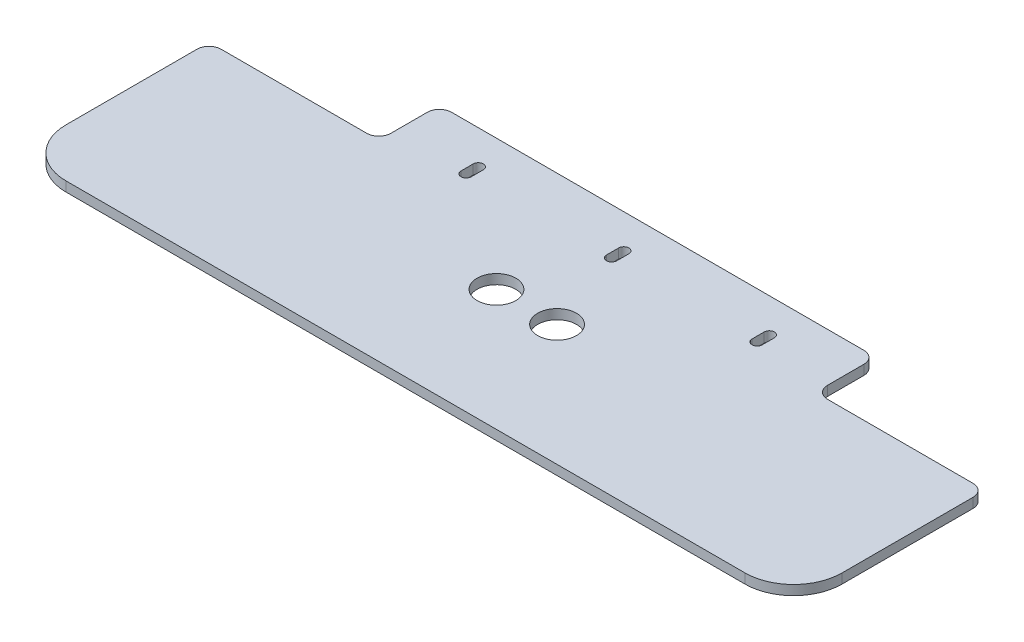
ISO-10303-21;
HEADER;
FILE_DESCRIPTION(('STEP AP214'),'2;1');
FILE_NAME('part.step','',(''),(''),'','','');
FILE_SCHEMA(('AUTOMOTIVE_DESIGN { 1 0 10303 214 1 1 1 1 }'));
ENDSEC;
DATA;
#1=APPLICATION_CONTEXT('core data for automotive mechanical design processes');
#2=APPLICATION_PROTOCOL_DEFINITION('international standard','automotive_design',2000,#1);
#3=PRODUCT_CONTEXT('',#1,'mechanical');
#4=PRODUCT('Part','Part','',(#3));
#5=PRODUCT_RELATED_PRODUCT_CATEGORY('part','',(#4));
#6=PRODUCT_DEFINITION_FORMATION('','',#4);
#7=PRODUCT_DEFINITION_CONTEXT('part definition',#1,'design');
#8=PRODUCT_DEFINITION('design','',#6,#7);
#9=PRODUCT_DEFINITION_SHAPE('','',#8);
#10=(LENGTH_UNIT() NAMED_UNIT(*) SI_UNIT(.MILLI.,.METRE.));
#11=(NAMED_UNIT(*) PLANE_ANGLE_UNIT() SI_UNIT($,.RADIAN.));
#12=(NAMED_UNIT(*) SI_UNIT($,.STERADIAN.) SOLID_ANGLE_UNIT());
#13=UNCERTAINTY_MEASURE_WITH_UNIT(LENGTH_MEASURE(1.E-05),#10,'distance_accuracy_value','');
#14=(GEOMETRIC_REPRESENTATION_CONTEXT(3) GLOBAL_UNCERTAINTY_ASSIGNED_CONTEXT((#13)) GLOBAL_UNIT_ASSIGNED_CONTEXT((#10,
#11,#12)) REPRESENTATION_CONTEXT('',''));
#15=CARTESIAN_POINT('',(0.,0.,0.));
#16=DIRECTION('',(0.,0.,1.));
#17=DIRECTION('',(1.,0.,0.));
#18=AXIS2_PLACEMENT_3D('',#15,#16,#17);
#19=CARTESIAN_POINT('',(-160.,4.,50.));
#20=DIRECTION('',(1.,0.,0.));
#21=DIRECTION('',(0.,0.,-1.));
#22=AXIS2_PLACEMENT_3D('',#19,#20,#21);
#23=PLANE('',#22);
#24=DIRECTION('',(0.,0.,1.));
#25=VECTOR('',#24,1.);
#26=CARTESIAN_POINT('',(-160.,4.,50.));
#27=LINE('',#26,#25);
#28=CARTESIAN_POINT('',(-160.,4.,-24.));
#29=VERTEX_POINT('',#28);
#30=CARTESIAN_POINT('',(-160.,4.,30.));
#31=VERTEX_POINT('',#30);
#32=EDGE_CURVE('E332',#29,#31,#27,.T.);
#33=ORIENTED_EDGE('',*,*,#32,.F.);
#34=DIRECTION('',(0.,-1.,0.));
#35=VECTOR('',#34,1.);
#36=CARTESIAN_POINT('',(-160.,4.,-24.));
#37=LINE('',#36,#35);
#38=CARTESIAN_POINT('',(-160.,0.,-24.));
#39=VERTEX_POINT('',#38);
#40=EDGE_CURVE('E473',#29,#39,#37,.T.);
#41=ORIENTED_EDGE('',*,*,#40,.T.);
#42=DIRECTION('',(0.,0.,1.));
#43=VECTOR('',#42,1.);
#44=CARTESIAN_POINT('',(-160.,0.,50.));
#45=LINE('',#44,#43);
#46=CARTESIAN_POINT('',(-160.,0.,30.));
#47=VERTEX_POINT('',#46);
#48=EDGE_CURVE('E331',#39,#47,#45,.T.);
#49=ORIENTED_EDGE('',*,*,#48,.T.);
#50=DIRECTION('',(0.,-1.,0.));
#51=VECTOR('',#50,1.);
#52=CARTESIAN_POINT('',(-160.,4.,30.));
#53=LINE('',#52,#51);
#54=EDGE_CURVE('E469',#47,#31,#53,.F.);
#55=ORIENTED_EDGE('',*,*,#54,.T.);
#56=EDGE_LOOP('',(#33,#41,#49,#55));
#57=FACE_BOUND('',#56,.T.);
#58=ADVANCED_FACE('F43',(#57),#23,.F.);
#59=CARTESIAN_POINT('',(-160.,4.,50.));
#60=DIRECTION('',(0.,0.,-1.));
#61=DIRECTION('',(-1.,0.,0.));
#62=AXIS2_PLACEMENT_3D('',#59,#60,#61);
#63=PLANE('',#62);
#64=DIRECTION('',(1.,0.,0.));
#65=VECTOR('',#64,1.);
#66=CARTESIAN_POINT('',(-160.,0.,50.));
#67=LINE('',#66,#65);
#68=CARTESIAN_POINT('',(-140.,0.,50.));
#69=VERTEX_POINT('',#68);
#70=CARTESIAN_POINT('',(140.,0.,50.));
#71=VERTEX_POINT('',#70);
#72=EDGE_CURVE('E366',#69,#71,#67,.T.);
#73=ORIENTED_EDGE('',*,*,#72,.T.);
#74=DIRECTION('',(0.,-1.,0.));
#75=VECTOR('',#74,1.);
#76=CARTESIAN_POINT('',(140.,4.,50.));
#77=LINE('',#76,#75);
#78=CARTESIAN_POINT('',(140.,4.,50.));
#79=VERTEX_POINT('',#78);
#80=EDGE_CURVE('E460',#71,#79,#77,.F.);
#81=ORIENTED_EDGE('',*,*,#80,.T.);
#82=DIRECTION('',(1.,0.,0.));
#83=VECTOR('',#82,1.);
#84=CARTESIAN_POINT('',(-160.,4.,50.));
#85=LINE('',#84,#83);
#86=CARTESIAN_POINT('',(-140.,4.,50.));
#87=VERTEX_POINT('',#86);
#88=EDGE_CURVE('E335',#87,#79,#85,.T.);
#89=ORIENTED_EDGE('',*,*,#88,.F.);
#90=DIRECTION('',(0.,-1.,0.));
#91=VECTOR('',#90,1.);
#92=CARTESIAN_POINT('',(-140.,4.,50.));
#93=LINE('',#92,#91);
#94=EDGE_CURVE('E456',#87,#69,#93,.T.);
#95=ORIENTED_EDGE('',*,*,#94,.T.);
#96=EDGE_LOOP('',(#73,#81,#89,#95));
#97=FACE_BOUND('',#96,.T.);
#98=ADVANCED_FACE('F568',(#97),#63,.F.);
#99=CARTESIAN_POINT('',(160.,4.,50.));
#100=DIRECTION('',(-1.,0.,0.));
#101=DIRECTION('',(0.,0.,1.));
#102=AXIS2_PLACEMENT_3D('',#99,#100,#101);
#103=PLANE('',#102);
#104=DIRECTION('',(0.,0.,-1.));
#105=VECTOR('',#104,1.);
#106=CARTESIAN_POINT('',(160.,0.,50.));
#107=LINE('',#106,#105);
#108=CARTESIAN_POINT('',(160.,0.,30.));
#109=VERTEX_POINT('',#108);
#110=CARTESIAN_POINT('',(160.,0.,-24.));
#111=VERTEX_POINT('',#110);
#112=EDGE_CURVE('E370',#109,#111,#107,.T.);
#113=ORIENTED_EDGE('',*,*,#112,.T.);
#114=DIRECTION('',(0.,-1.,0.));
#115=VECTOR('',#114,1.);
#116=CARTESIAN_POINT('',(160.,4.,-24.));
#117=LINE('',#116,#115);
#118=CARTESIAN_POINT('',(160.,4.,-24.));
#119=VERTEX_POINT('',#118);
#120=EDGE_CURVE('E496',#111,#119,#117,.F.);
#121=ORIENTED_EDGE('',*,*,#120,.T.);
#122=DIRECTION('',(0.,0.,-1.));
#123=VECTOR('',#122,1.);
#124=CARTESIAN_POINT('',(160.,4.,50.));
#125=LINE('',#124,#123);
#126=CARTESIAN_POINT('',(160.,4.,30.));
#127=VERTEX_POINT('',#126);
#128=EDGE_CURVE('E340',#127,#119,#125,.T.);
#129=ORIENTED_EDGE('',*,*,#128,.F.);
#130=DIRECTION('',(0.,-1.,0.));
#131=VECTOR('',#130,1.);
#132=CARTESIAN_POINT('',(160.,4.,30.));
#133=LINE('',#132,#131);
#134=EDGE_CURVE('E445',#127,#109,#133,.T.);
#135=ORIENTED_EDGE('',*,*,#134,.T.);
#136=EDGE_LOOP('',(#113,#121,#129,#135));
#137=FACE_BOUND('',#136,.T.);
#138=ADVANCED_FACE('F574',(#137),#103,.F.);
#139=CARTESIAN_POINT('',(90.,4.,-29.));
#140=DIRECTION('',(0.,0.,1.));
#141=DIRECTION('',(1.,0.,0.));
#142=AXIS2_PLACEMENT_3D('',#139,#140,#141);
#143=PLANE('',#142);
#144=DIRECTION('',(-1.,0.,0.));
#145=VECTOR('',#144,1.);
#146=CARTESIAN_POINT('',(90.,4.,-29.));
#147=LINE('',#146,#145);
#148=CARTESIAN_POINT('',(155.,4.,-29.));
#149=VERTEX_POINT('',#148);
#150=CARTESIAN_POINT('',(95.,4.,-29.));
#151=VERTEX_POINT('',#150);
#152=EDGE_CURVE('E344',#149,#151,#147,.T.);
#153=ORIENTED_EDGE('',*,*,#152,.F.);
#154=DIRECTION('',(0.,-1.,0.));
#155=VECTOR('',#154,1.);
#156=CARTESIAN_POINT('',(155.,4.,-29.));
#157=LINE('',#156,#155);
#158=CARTESIAN_POINT('',(155.,0.,-29.));
#159=VERTEX_POINT('',#158);
#160=EDGE_CURVE('E492',#149,#159,#157,.T.);
#161=ORIENTED_EDGE('',*,*,#160,.T.);
#162=DIRECTION('',(-1.,0.,0.));
#163=VECTOR('',#162,1.);
#164=CARTESIAN_POINT('',(90.,0.,-29.));
#165=LINE('',#164,#163);
#166=CARTESIAN_POINT('',(95.,0.,-29.));
#167=VERTEX_POINT('',#166);
#168=EDGE_CURVE('E374',#159,#167,#165,.T.);
#169=ORIENTED_EDGE('',*,*,#168,.T.);
#170=DIRECTION('',(0.,-1.,0.));
#171=VECTOR('',#170,1.);
#172=CARTESIAN_POINT('',(95.,4.,-29.));
#173=LINE('',#172,#171);
#174=EDGE_CURVE('E428',#167,#151,#173,.F.);
#175=ORIENTED_EDGE('',*,*,#174,.T.);
#176=EDGE_LOOP('',(#153,#161,#169,#175));
#177=FACE_BOUND('',#176,.T.);
#178=ADVANCED_FACE('F633',(#177),#143,.F.);
#179=CARTESIAN_POINT('',(90.,4.,-54.));
#180=DIRECTION('',(-1.,0.,0.));
#181=DIRECTION('',(0.,0.,1.));
#182=AXIS2_PLACEMENT_3D('',#179,#180,#181);
#183=PLANE('',#182);
#184=DIRECTION('',(0.,0.,-1.));
#185=VECTOR('',#184,1.);
#186=CARTESIAN_POINT('',(90.,4.,-54.));
#187=LINE('',#186,#185);
#188=CARTESIAN_POINT('',(90.,4.,-34.));
#189=VERTEX_POINT('',#188);
#190=CARTESIAN_POINT('',(90.,4.,-49.));
#191=VERTEX_POINT('',#190);
#192=EDGE_CURVE('E347',#189,#191,#187,.T.);
#193=ORIENTED_EDGE('',*,*,#192,.F.);
#194=DIRECTION('',(0.,-1.,0.));
#195=VECTOR('',#194,1.);
#196=CARTESIAN_POINT('',(90.,0.,-34.));
#197=LINE('',#196,#195);
#198=CARTESIAN_POINT('',(90.,0.,-34.));
#199=VERTEX_POINT('',#198);
#200=EDGE_CURVE('E424',#189,#199,#197,.T.);
#201=ORIENTED_EDGE('',*,*,#200,.T.);
#202=DIRECTION('',(0.,0.,-1.));
#203=VECTOR('',#202,1.);
#204=CARTESIAN_POINT('',(90.,0.,-54.));
#205=LINE('',#204,#203);
#206=CARTESIAN_POINT('',(90.,0.,-49.));
#207=VERTEX_POINT('',#206);
#208=EDGE_CURVE('E377',#199,#207,#205,.T.);
#209=ORIENTED_EDGE('',*,*,#208,.T.);
#210=DIRECTION('',(0.,-1.,0.));
#211=VECTOR('',#210,1.);
#212=CARTESIAN_POINT('',(90.,4.,-49.));
#213=LINE('',#212,#211);
#214=EDGE_CURVE('E421',#207,#191,#213,.F.);
#215=ORIENTED_EDGE('',*,*,#214,.T.);
#216=EDGE_LOOP('',(#193,#201,#209,#215));
#217=FACE_BOUND('',#216,.T.);
#218=ADVANCED_FACE('F641',(#217),#183,.F.);
#219=CARTESIAN_POINT('',(-90.,4.,-54.));
#220=DIRECTION('',(0.,0.,1.));
#221=DIRECTION('',(1.,0.,0.));
#222=AXIS2_PLACEMENT_3D('',#219,#220,#221);
#223=PLANE('',#222);
#224=DIRECTION('',(-1.,0.,0.));
#225=VECTOR('',#224,1.);
#226=CARTESIAN_POINT('',(-90.,0.,-54.));
#227=LINE('',#226,#225);
#228=CARTESIAN_POINT('',(85.,0.,-54.));
#229=VERTEX_POINT('',#228);
#230=CARTESIAN_POINT('',(-85.,0.,-54.));
#231=VERTEX_POINT('',#230);
#232=EDGE_CURVE('E381',#229,#231,#227,.T.);
#233=ORIENTED_EDGE('',*,*,#232,.T.);
#234=DIRECTION('',(0.,-1.,0.));
#235=VECTOR('',#234,1.);
#236=CARTESIAN_POINT('',(-85.,4.,-54.));
#237=LINE('',#236,#235);
#238=CARTESIAN_POINT('',(-85.,4.,-54.));
#239=VERTEX_POINT('',#238);
#240=EDGE_CURVE('E412',#231,#239,#237,.F.);
#241=ORIENTED_EDGE('',*,*,#240,.T.);
#242=DIRECTION('',(-1.,0.,0.));
#243=VECTOR('',#242,1.);
#244=CARTESIAN_POINT('',(-90.,4.,-54.));
#245=LINE('',#244,#243);
#246=CARTESIAN_POINT('',(85.,4.,-54.));
#247=VERTEX_POINT('',#246);
#248=EDGE_CURVE('E351',#247,#239,#245,.T.);
#249=ORIENTED_EDGE('',*,*,#248,.F.);
#250=DIRECTION('',(0.,-1.,0.));
#251=VECTOR('',#250,1.);
#252=CARTESIAN_POINT('',(85.,4.,-54.));
#253=LINE('',#252,#251);
#254=EDGE_CURVE('E408',#247,#229,#253,.T.);
#255=ORIENTED_EDGE('',*,*,#254,.T.);
#256=EDGE_LOOP('',(#233,#241,#249,#255));
#257=FACE_BOUND('',#256,.T.);
#258=ADVANCED_FACE('F648',(#257),#223,.F.);
#259=CARTESIAN_POINT('',(-90.,4.,-54.));
#260=DIRECTION('',(1.,0.,0.));
#261=DIRECTION('',(0.,0.,-1.));
#262=AXIS2_PLACEMENT_3D('',#259,#260,#261);
#263=PLANE('',#262);
#264=DIRECTION('',(0.,0.,1.));
#265=VECTOR('',#264,1.);
#266=CARTESIAN_POINT('',(-90.,0.,-54.));
#267=LINE('',#266,#265);
#268=CARTESIAN_POINT('',(-90.,0.,-49.));
#269=VERTEX_POINT('',#268);
#270=CARTESIAN_POINT('',(-90.,0.,-34.));
#271=VERTEX_POINT('',#270);
#272=EDGE_CURVE('E385',#269,#271,#267,.T.);
#273=ORIENTED_EDGE('',*,*,#272,.T.);
#274=DIRECTION('',(0.,-1.,0.));
#275=VECTOR('',#274,1.);
#276=CARTESIAN_POINT('',(-90.,4.,-34.));
#277=LINE('',#276,#275);
#278=CARTESIAN_POINT('',(-90.,4.,-34.));
#279=VERTEX_POINT('',#278);
#280=EDGE_CURVE('E399',#271,#279,#277,.F.);
#281=ORIENTED_EDGE('',*,*,#280,.T.);
#282=DIRECTION('',(0.,0.,1.));
#283=VECTOR('',#282,1.);
#284=CARTESIAN_POINT('',(-90.,4.,-54.));
#285=LINE('',#284,#283);
#286=CARTESIAN_POINT('',(-90.,4.,-49.));
#287=VERTEX_POINT('',#286);
#288=EDGE_CURVE('E355',#287,#279,#285,.T.);
#289=ORIENTED_EDGE('',*,*,#288,.F.);
#290=DIRECTION('',(0.,-1.,0.));
#291=VECTOR('',#290,1.);
#292=CARTESIAN_POINT('',(-90.,4.,-49.));
#293=LINE('',#292,#291);
#294=EDGE_CURVE('E395',#287,#269,#293,.T.);
#295=ORIENTED_EDGE('',*,*,#294,.T.);
#296=EDGE_LOOP('',(#273,#281,#289,#295));
#297=FACE_BOUND('',#296,.T.);
#298=ADVANCED_FACE('F655',(#297),#263,.F.);
#299=CARTESIAN_POINT('',(-90.,4.,-29.));
#300=DIRECTION('',(0.,0.,1.));
#301=DIRECTION('',(1.,0.,0.));
#302=AXIS2_PLACEMENT_3D('',#299,#300,#301);
#303=PLANE('',#302);
#304=DIRECTION('',(-1.,0.,0.));
#305=VECTOR('',#304,1.);
#306=CARTESIAN_POINT('',(-90.,0.,-29.));
#307=LINE('',#306,#305);
#308=CARTESIAN_POINT('',(-95.,0.,-29.));
#309=VERTEX_POINT('',#308);
#310=CARTESIAN_POINT('',(-155.,0.,-29.));
#311=VERTEX_POINT('',#310);
#312=EDGE_CURVE('E336',#309,#311,#307,.T.);
#313=ORIENTED_EDGE('',*,*,#312,.T.);
#314=DIRECTION('',(0.,-1.,0.));
#315=VECTOR('',#314,1.);
#316=CARTESIAN_POINT('',(-155.,4.,-29.));
#317=LINE('',#316,#315);
#318=CARTESIAN_POINT('',(-155.,4.,-29.));
#319=VERTEX_POINT('',#318);
#320=EDGE_CURVE('E483',#311,#319,#317,.F.);
#321=ORIENTED_EDGE('',*,*,#320,.T.);
#322=DIRECTION('',(-1.,0.,0.));
#323=VECTOR('',#322,1.);
#324=CARTESIAN_POINT('',(-90.,4.,-29.));
#325=LINE('',#324,#323);
#326=CARTESIAN_POINT('',(-95.,4.,-29.));
#327=VERTEX_POINT('',#326);
#328=EDGE_CURVE('E359',#327,#319,#325,.T.);
#329=ORIENTED_EDGE('',*,*,#328,.F.);
#330=DIRECTION('',(0.,-1.,0.));
#331=VECTOR('',#330,1.);
#332=CARTESIAN_POINT('',(-95.,0.,-29.));
#333=LINE('',#332,#331);
#334=EDGE_CURVE('E363',#327,#309,#333,.T.);
#335=ORIENTED_EDGE('',*,*,#334,.T.);
#336=EDGE_LOOP('',(#313,#321,#329,#335));
#337=FACE_BOUND('',#336,.T.);
#338=ADVANCED_FACE('F660',(#337),#303,.F.);
#339=CARTESIAN_POINT('',(0.,4.,0.));
#340=DIRECTION('',(0.,1.,0.));
#341=DIRECTION('',(0.,0.,1.));
#342=AXIS2_PLACEMENT_3D('',#339,#340,#341);
#343=PLANE('',#342);
#344=CARTESIAN_POINT('',(-60.,4.,-34.9999999999996));
#345=DIRECTION('',(0.,1.,0.));
#346=DIRECTION('',(0.,0.,1.));
#347=AXIS2_PLACEMENT_3D('',#344,#345,#346);
#348=CIRCLE('',#347,2.1);
#349=CARTESIAN_POINT('',(-62.1,4.,-34.9999999999996));
#350=VERTEX_POINT('',#349);
#351=CARTESIAN_POINT('',(-57.9,4.,-34.9999999999996));
#352=VERTEX_POINT('',#351);
#353=EDGE_CURVE('E59',#350,#352,#348,.T.);
#354=ORIENTED_EDGE('',*,*,#353,.F.);
#355=DIRECTION('',(0.,0.,1.));
#356=VECTOR('',#355,1.);
#357=CARTESIAN_POINT('',(-62.1,4.,-34.9999999999996));
#358=LINE('',#357,#356);
#359=CARTESIAN_POINT('',(-62.1,4.,-39.9999999999996));
#360=VERTEX_POINT('',#359);
#361=EDGE_CURVE('E268',#360,#350,#358,.T.);
#362=ORIENTED_EDGE('',*,*,#361,.F.);
#363=CARTESIAN_POINT('',(-60.,4.,-39.9999999999996));
#364=DIRECTION('',(0.,1.,0.));
#365=DIRECTION('',(0.,0.,1.));
#366=AXIS2_PLACEMENT_3D('',#363,#364,#365);
#367=CIRCLE('',#366,2.1);
#368=CARTESIAN_POINT('',(-57.9,4.,-39.9999999999996));
#369=VERTEX_POINT('',#368);
#370=EDGE_CURVE('E281',#369,#360,#367,.T.);
#371=ORIENTED_EDGE('',*,*,#370,.F.);
#372=DIRECTION('',(0.,0.,-1.));
#373=VECTOR('',#372,1.);
#374=CARTESIAN_POINT('',(-57.9,4.,-34.9999999999996));
#375=LINE('',#374,#373);
#376=EDGE_CURVE('E285',#352,#369,#375,.T.);
#377=ORIENTED_EDGE('',*,*,#376,.F.);
#378=EDGE_LOOP('',(#354,#362,#371,#377));
#379=FACE_BOUND('',#378,.T.);
#380=CARTESIAN_POINT('',(60.,4.,-35.));
#381=DIRECTION('',(0.,1.,0.));
#382=DIRECTION('',(0.,0.,1.));
#383=AXIS2_PLACEMENT_3D('',#380,#381,#382);
#384=CIRCLE('',#383,2.1);
#385=CARTESIAN_POINT('',(57.9,4.,-35.));
#386=VERTEX_POINT('',#385);
#387=CARTESIAN_POINT('',(62.1,4.,-35.));
#388=VERTEX_POINT('',#387);
#389=EDGE_CURVE('E67',#386,#388,#384,.T.);
#390=ORIENTED_EDGE('',*,*,#389,.F.);
#391=DIRECTION('',(0.,0.,1.));
#392=VECTOR('',#391,1.);
#393=CARTESIAN_POINT('',(57.9,4.,-35.));
#394=LINE('',#393,#392);
#395=CARTESIAN_POINT('',(57.9,4.,-40.));
#396=VERTEX_POINT('',#395);
#397=EDGE_CURVE('E240',#396,#386,#394,.T.);
#398=ORIENTED_EDGE('',*,*,#397,.F.);
#399=CARTESIAN_POINT('',(60.,4.,-40.));
#400=DIRECTION('',(0.,1.,0.));
#401=DIRECTION('',(0.,0.,1.));
#402=AXIS2_PLACEMENT_3D('',#399,#400,#401);
#403=CIRCLE('',#402,2.1);
#404=CARTESIAN_POINT('',(62.1,4.,-40.));
#405=VERTEX_POINT('',#404);
#406=EDGE_CURVE('E247',#405,#396,#403,.T.);
#407=ORIENTED_EDGE('',*,*,#406,.F.);
#408=DIRECTION('',(0.,0.,-1.));
#409=VECTOR('',#408,1.);
#410=CARTESIAN_POINT('',(62.1,4.,-35.));
#411=LINE('',#410,#409);
#412=EDGE_CURVE('E254',#388,#405,#411,.T.);
#413=ORIENTED_EDGE('',*,*,#412,.F.);
#414=EDGE_LOOP('',(#390,#398,#407,#413));
#415=FACE_BOUND('',#414,.T.);
#416=CARTESIAN_POINT('',(0.,4.,-35.));
#417=DIRECTION('',(0.,1.,0.));
#418=DIRECTION('',(0.,0.,1.));
#419=AXIS2_PLACEMENT_3D('',#416,#417,#418);
#420=CIRCLE('',#419,2.1);
#421=CARTESIAN_POINT('',(-2.1,4.,-35.));
#422=VERTEX_POINT('',#421);
#423=CARTESIAN_POINT('',(2.1,4.,-35.));
#424=VERTEX_POINT('',#423);
#425=EDGE_CURVE('E256',#422,#424,#420,.T.);
#426=ORIENTED_EDGE('',*,*,#425,.F.);
#427=DIRECTION('',(0.,0.,1.));
#428=VECTOR('',#427,1.);
#429=CARTESIAN_POINT('',(-2.1,4.,-35.));
#430=LINE('',#429,#428);
#431=CARTESIAN_POINT('',(-2.1,4.,-40.));
#432=VERTEX_POINT('',#431);
#433=EDGE_CURVE('E298',#432,#422,#430,.T.);
#434=ORIENTED_EDGE('',*,*,#433,.F.);
#435=CARTESIAN_POINT('',(0.,4.,-40.));
#436=DIRECTION('',(0.,1.,0.));
#437=DIRECTION('',(0.,0.,1.));
#438=AXIS2_PLACEMENT_3D('',#435,#436,#437);
#439=CIRCLE('',#438,2.1);
#440=CARTESIAN_POINT('',(2.1,4.,-40.));
#441=VERTEX_POINT('',#440);
#442=EDGE_CURVE('E294',#441,#432,#439,.T.);
#443=ORIENTED_EDGE('',*,*,#442,.F.);
#444=DIRECTION('',(0.,0.,-1.));
#445=VECTOR('',#444,1.);
#446=CARTESIAN_POINT('',(2.1,4.,-35.));
#447=LINE('',#446,#445);
#448=EDGE_CURVE('E260',#424,#441,#447,.T.);
#449=ORIENTED_EDGE('',*,*,#448,.F.);
#450=EDGE_LOOP('',(#426,#434,#443,#449));
#451=FACE_BOUND('',#450,.T.);
#452=CARTESIAN_POINT('',(-12.4999975262829,4.,-0.00786402698437699));
#453=DIRECTION('',(0.,1.,0.));
#454=DIRECTION('',(0.,0.,1.));
#455=AXIS2_PLACEMENT_3D('',#452,#453,#454);
#456=CIRCLE('',#455,8.);
#457=CARTESIAN_POINT('',(-12.4999975262829,4.,7.99213597301562));
#458=VERTEX_POINT('',#457);
#459=EDGE_CURVE('E327',#458,#458,#456,.T.);
#460=ORIENTED_EDGE('',*,*,#459,.F.);
#461=EDGE_LOOP('',(#460));
#462=FACE_BOUND('',#461,.T.);
#463=CARTESIAN_POINT('',(12.4999975262829,4.,0.00786402698438158));
#464=DIRECTION('',(0.,1.,0.));
#465=DIRECTION('',(0.,0.,1.));
#466=AXIS2_PLACEMENT_3D('',#463,#464,#465);
#467=CIRCLE('',#466,8.);
#468=CARTESIAN_POINT('',(12.4999975262829,4.,8.00786402698438));
#469=VERTEX_POINT('',#468);
#470=EDGE_CURVE('E320',#469,#469,#467,.T.);
#471=ORIENTED_EDGE('',*,*,#470,.F.);
#472=EDGE_LOOP('',(#471));
#473=FACE_BOUND('',#472,.T.);
#474=ORIENTED_EDGE('',*,*,#328,.T.);
#475=CARTESIAN_POINT('',(-155.,4.,-24.));
#476=DIRECTION('',(0.,1.,0.));
#477=DIRECTION('',(0.,0.,1.));
#478=AXIS2_PLACEMENT_3D('',#475,#476,#477);
#479=CIRCLE('',#478,5.);
#480=EDGE_CURVE('E489',#319,#29,#479,.T.);
#481=ORIENTED_EDGE('',*,*,#480,.T.);
#482=ORIENTED_EDGE('',*,*,#32,.T.);
#483=CARTESIAN_POINT('',(-140.,4.,30.));
#484=DIRECTION('',(0.,1.,0.));
#485=DIRECTION('',(0.,0.,1.));
#486=AXIS2_PLACEMENT_3D('',#483,#484,#485);
#487=CIRCLE('',#486,20.);
#488=EDGE_CURVE('E463',#31,#87,#487,.T.);
#489=ORIENTED_EDGE('',*,*,#488,.T.);
#490=ORIENTED_EDGE('',*,*,#88,.T.);
#491=CARTESIAN_POINT('',(140.,4.,30.));
#492=DIRECTION('',(0.,1.,0.));
#493=DIRECTION('',(0.,0.,1.));
#494=AXIS2_PLACEMENT_3D('',#491,#492,#493);
#495=CIRCLE('',#494,20.);
#496=EDGE_CURVE('E466',#79,#127,#495,.T.);
#497=ORIENTED_EDGE('',*,*,#496,.T.);
#498=ORIENTED_EDGE('',*,*,#128,.T.);
#499=CARTESIAN_POINT('',(155.,4.,-24.));
#500=DIRECTION('',(0.,1.,0.));
#501=DIRECTION('',(0.,0.,1.));
#502=AXIS2_PLACEMENT_3D('',#499,#500,#501);
#503=CIRCLE('',#502,5.);
#504=EDGE_CURVE('E486',#119,#149,#503,.T.);
#505=ORIENTED_EDGE('',*,*,#504,.T.);
#506=ORIENTED_EDGE('',*,*,#152,.T.);
#507=CARTESIAN_POINT('',(95.,4.,-34.));
#508=DIRECTION('',(0.,1.,0.));
#509=DIRECTION('',(0.,0.,1.));
#510=AXIS2_PLACEMENT_3D('',#507,#508,#509);
#511=CIRCLE('',#510,5.);
#512=EDGE_CURVE('E442',#151,#189,#511,.F.);
#513=ORIENTED_EDGE('',*,*,#512,.T.);
#514=ORIENTED_EDGE('',*,*,#192,.T.);
#515=CARTESIAN_POINT('',(85.,4.,-49.));
#516=DIRECTION('',(0.,1.,0.));
#517=DIRECTION('',(0.,0.,1.));
#518=AXIS2_PLACEMENT_3D('',#515,#516,#517);
#519=CIRCLE('',#518,5.);
#520=EDGE_CURVE('E415',#191,#247,#519,.T.);
#521=ORIENTED_EDGE('',*,*,#520,.T.);
#522=ORIENTED_EDGE('',*,*,#248,.T.);
#523=CARTESIAN_POINT('',(-85.,4.,-49.));
#524=DIRECTION('',(0.,1.,0.));
#525=DIRECTION('',(0.,0.,1.));
#526=AXIS2_PLACEMENT_3D('',#523,#524,#525);
#527=CIRCLE('',#526,5.);
#528=EDGE_CURVE('E418',#239,#287,#527,.T.);
#529=ORIENTED_EDGE('',*,*,#528,.T.);
#530=ORIENTED_EDGE('',*,*,#288,.T.);
#531=CARTESIAN_POINT('',(-95.,4.,-34.));
#532=DIRECTION('',(0.,1.,0.));
#533=DIRECTION('',(0.,0.,1.));
#534=AXIS2_PLACEMENT_3D('',#531,#532,#533);
#535=CIRCLE('',#534,5.);
#536=EDGE_CURVE('E435',#279,#327,#535,.F.);
#537=ORIENTED_EDGE('',*,*,#536,.T.);
#538=EDGE_LOOP('',(#474,#481,#482,#489,#490,#497,#498,#505,#506,#513,#514,#521,#522,#529,#530,#537));
#539=FACE_BOUND('',#538,.T.);
#540=ADVANCED_FACE('F251',(#379,#415,#451,#462,#473,#539),#343,.T.);
#541=CARTESIAN_POINT('',(0.,0.,0.));
#542=DIRECTION('',(0.,1.,0.));
#543=DIRECTION('',(0.,0.,1.));
#544=AXIS2_PLACEMENT_3D('',#541,#542,#543);
#545=PLANE('',#544);
#546=DIRECTION('',(0.,0.,1.));
#547=VECTOR('',#546,1.);
#548=CARTESIAN_POINT('',(-62.1,0.,0.));
#549=LINE('',#548,#547);
#550=CARTESIAN_POINT('',(-62.1,0.,-39.9999999999996));
#551=VERTEX_POINT('',#550);
#552=CARTESIAN_POINT('',(-62.1,0.,-34.9999999999996));
#553=VERTEX_POINT('',#552);
#554=EDGE_CURVE('E52',#551,#553,#549,.T.);
#555=ORIENTED_EDGE('',*,*,#554,.T.);
#556=CARTESIAN_POINT('',(-60.,0.,-34.9999999999996));
#557=DIRECTION('',(0.,1.,0.));
#558=DIRECTION('',(0.,0.,1.));
#559=AXIS2_PLACEMENT_3D('',#556,#557,#558);
#560=CIRCLE('',#559,2.1);
#561=CARTESIAN_POINT('',(-57.9,0.,-34.9999999999996));
#562=VERTEX_POINT('',#561);
#563=EDGE_CURVE('E11',#553,#562,#560,.T.);
#564=ORIENTED_EDGE('',*,*,#563,.T.);
#565=DIRECTION('',(0.,0.,-1.));
#566=VECTOR('',#565,1.);
#567=CARTESIAN_POINT('',(-57.9,0.,0.));
#568=LINE('',#567,#566);
#569=CARTESIAN_POINT('',(-57.9,0.,-39.9999999999996));
#570=VERTEX_POINT('',#569);
#571=EDGE_CURVE('E528',#562,#570,#568,.T.);
#572=ORIENTED_EDGE('',*,*,#571,.T.);
#573=CARTESIAN_POINT('',(-60.,0.,-39.9999999999996));
#574=DIRECTION('',(0.,1.,0.));
#575=DIRECTION('',(0.,0.,1.));
#576=AXIS2_PLACEMENT_3D('',#573,#574,#575);
#577=CIRCLE('',#576,2.1);
#578=EDGE_CURVE('E532',#570,#551,#577,.T.);
#579=ORIENTED_EDGE('',*,*,#578,.T.);
#580=EDGE_LOOP('',(#555,#564,#572,#579));
#581=FACE_BOUND('',#580,.T.);
#582=DIRECTION('',(0.,0.,1.));
#583=VECTOR('',#582,1.);
#584=CARTESIAN_POINT('',(57.9,0.,0.));
#585=LINE('',#584,#583);
#586=CARTESIAN_POINT('',(57.9,0.,-40.));
#587=VERTEX_POINT('',#586);
#588=CARTESIAN_POINT('',(57.9,0.,-35.));
#589=VERTEX_POINT('',#588);
#590=EDGE_CURVE('E523',#587,#589,#585,.T.);
#591=ORIENTED_EDGE('',*,*,#590,.T.);
#592=CARTESIAN_POINT('',(60.,0.,-35.));
#593=DIRECTION('',(0.,1.,0.));
#594=DIRECTION('',(0.,0.,1.));
#595=AXIS2_PLACEMENT_3D('',#592,#593,#594);
#596=CIRCLE('',#595,2.1);
#597=CARTESIAN_POINT('',(62.1,0.,-35.));
#598=VERTEX_POINT('',#597);
#599=EDGE_CURVE('E233',#589,#598,#596,.T.);
#600=ORIENTED_EDGE('',*,*,#599,.T.);
#601=DIRECTION('',(0.,0.,-1.));
#602=VECTOR('',#601,1.);
#603=CARTESIAN_POINT('',(62.1,0.,0.));
#604=LINE('',#603,#602);
#605=CARTESIAN_POINT('',(62.1,0.,-40.));
#606=VERTEX_POINT('',#605);
#607=EDGE_CURVE('E515',#598,#606,#604,.T.);
#608=ORIENTED_EDGE('',*,*,#607,.T.);
#609=CARTESIAN_POINT('',(60.,0.,-40.));
#610=DIRECTION('',(0.,1.,0.));
#611=DIRECTION('',(0.,0.,1.));
#612=AXIS2_PLACEMENT_3D('',#609,#610,#611);
#613=CIRCLE('',#612,2.1);
#614=EDGE_CURVE('E519',#606,#587,#613,.T.);
#615=ORIENTED_EDGE('',*,*,#614,.T.);
#616=EDGE_LOOP('',(#591,#600,#608,#615));
#617=FACE_BOUND('',#616,.T.);
#618=DIRECTION('',(0.,0.,1.));
#619=VECTOR('',#618,1.);
#620=CARTESIAN_POINT('',(-2.1,0.,0.));
#621=LINE('',#620,#619);
#622=CARTESIAN_POINT('',(-2.1,0.,-40.));
#623=VERTEX_POINT('',#622);
#624=CARTESIAN_POINT('',(-2.1,0.,-35.));
#625=VERTEX_POINT('',#624);
#626=EDGE_CURVE('E507',#623,#625,#621,.T.);
#627=ORIENTED_EDGE('',*,*,#626,.T.);
#628=CARTESIAN_POINT('',(0.,0.,-35.));
#629=DIRECTION('',(0.,1.,0.));
#630=DIRECTION('',(0.,0.,1.));
#631=AXIS2_PLACEMENT_3D('',#628,#629,#630);
#632=CIRCLE('',#631,2.1);
#633=CARTESIAN_POINT('',(2.1,0.,-35.));
#634=VERTEX_POINT('',#633);
#635=EDGE_CURVE('E511',#625,#634,#632,.T.);
#636=ORIENTED_EDGE('',*,*,#635,.T.);
#637=DIRECTION('',(0.,0.,-1.));
#638=VECTOR('',#637,1.);
#639=CARTESIAN_POINT('',(2.1,0.,0.));
#640=LINE('',#639,#638);
#641=CARTESIAN_POINT('',(2.1,0.,-40.));
#642=VERTEX_POINT('',#641);
#643=EDGE_CURVE('E499',#634,#642,#640,.T.);
#644=ORIENTED_EDGE('',*,*,#643,.T.);
#645=CARTESIAN_POINT('',(0.,0.,-40.));
#646=DIRECTION('',(0.,1.,0.));
#647=DIRECTION('',(0.,0.,1.));
#648=AXIS2_PLACEMENT_3D('',#645,#646,#647);
#649=CIRCLE('',#648,2.1);
#650=EDGE_CURVE('E503',#642,#623,#649,.T.);
#651=ORIENTED_EDGE('',*,*,#650,.T.);
#652=EDGE_LOOP('',(#627,#636,#644,#651));
#653=FACE_BOUND('',#652,.T.);
#654=CARTESIAN_POINT('',(-12.4999975262829,0.,-0.00786402698437699));
#655=DIRECTION('',(0.,-1.,0.));
#656=DIRECTION('',(0.,0.,-1.));
#657=AXIS2_PLACEMENT_3D('',#654,#655,#656);
#658=CIRCLE('',#657,8.);
#659=CARTESIAN_POINT('',(-12.4999975262829,0.,-8.00786402698438));
#660=VERTEX_POINT('',#659);
#661=EDGE_CURVE('E316',#660,#660,#658,.T.);
#662=ORIENTED_EDGE('',*,*,#661,.F.);
#663=EDGE_LOOP('',(#662));
#664=FACE_BOUND('',#663,.T.);
#665=CARTESIAN_POINT('',(12.4999975262829,0.,0.00786402698438158));
#666=DIRECTION('',(0.,-1.,0.));
#667=DIRECTION('',(0.,0.,-1.));
#668=AXIS2_PLACEMENT_3D('',#665,#666,#667);
#669=CIRCLE('',#668,8.);
#670=CARTESIAN_POINT('',(12.4999975262829,0.,-7.99213597301562));
#671=VERTEX_POINT('',#670);
#672=EDGE_CURVE('E306',#671,#671,#669,.T.);
#673=ORIENTED_EDGE('',*,*,#672,.F.);
#674=EDGE_LOOP('',(#673));
#675=FACE_BOUND('',#674,.T.);
#676=ORIENTED_EDGE('',*,*,#48,.F.);
#677=CARTESIAN_POINT('',(-155.,0.,-24.));
#678=DIRECTION('',(0.,1.,0.));
#679=DIRECTION('',(0.,0.,1.));
#680=AXIS2_PLACEMENT_3D('',#677,#678,#679);
#681=CIRCLE('',#680,5.);
#682=EDGE_CURVE('E480',#39,#311,#681,.F.);
#683=ORIENTED_EDGE('',*,*,#682,.T.);
#684=ORIENTED_EDGE('',*,*,#312,.F.);
#685=CARTESIAN_POINT('',(-95.,0.,-34.));
#686=DIRECTION('',(0.,1.,0.));
#687=DIRECTION('',(0.,0.,1.));
#688=AXIS2_PLACEMENT_3D('',#685,#686,#687);
#689=CIRCLE('',#688,5.);
#690=EDGE_CURVE('E432',#309,#271,#689,.T.);
#691=ORIENTED_EDGE('',*,*,#690,.T.);
#692=ORIENTED_EDGE('',*,*,#272,.F.);
#693=CARTESIAN_POINT('',(-85.,0.,-49.));
#694=DIRECTION('',(0.,1.,0.));
#695=DIRECTION('',(0.,0.,1.));
#696=AXIS2_PLACEMENT_3D('',#693,#694,#695);
#697=CIRCLE('',#696,5.);
#698=EDGE_CURVE('E405',#269,#231,#697,.F.);
#699=ORIENTED_EDGE('',*,*,#698,.T.);
#700=ORIENTED_EDGE('',*,*,#232,.F.);
#701=CARTESIAN_POINT('',(85.,0.,-49.));
#702=DIRECTION('',(0.,1.,0.));
#703=DIRECTION('',(0.,0.,1.));
#704=AXIS2_PLACEMENT_3D('',#701,#702,#703);
#705=CIRCLE('',#704,5.);
#706=EDGE_CURVE('E402',#229,#207,#705,.F.);
#707=ORIENTED_EDGE('',*,*,#706,.T.);
#708=ORIENTED_EDGE('',*,*,#208,.F.);
#709=CARTESIAN_POINT('',(95.,0.,-34.));
#710=DIRECTION('',(0.,1.,0.));
#711=DIRECTION('',(0.,0.,1.));
#712=AXIS2_PLACEMENT_3D('',#709,#710,#711);
#713=CIRCLE('',#712,5.);
#714=EDGE_CURVE('E438',#199,#167,#713,.T.);
#715=ORIENTED_EDGE('',*,*,#714,.T.);
#716=ORIENTED_EDGE('',*,*,#168,.F.);
#717=CARTESIAN_POINT('',(155.,0.,-24.));
#718=DIRECTION('',(0.,1.,0.));
#719=DIRECTION('',(0.,0.,1.));
#720=AXIS2_PLACEMENT_3D('',#717,#718,#719);
#721=CIRCLE('',#720,5.);
#722=EDGE_CURVE('E477',#159,#111,#721,.F.);
#723=ORIENTED_EDGE('',*,*,#722,.T.);
#724=ORIENTED_EDGE('',*,*,#112,.F.);
#725=CARTESIAN_POINT('',(140.,0.,30.));
#726=DIRECTION('',(0.,1.,0.));
#727=DIRECTION('',(0.,0.,1.));
#728=AXIS2_PLACEMENT_3D('',#725,#726,#727);
#729=CIRCLE('',#728,20.);
#730=EDGE_CURVE('E453',#109,#71,#729,.F.);
#731=ORIENTED_EDGE('',*,*,#730,.T.);
#732=ORIENTED_EDGE('',*,*,#72,.F.);
#733=CARTESIAN_POINT('',(-140.,0.,30.));
#734=DIRECTION('',(0.,1.,0.));
#735=DIRECTION('',(0.,0.,1.));
#736=AXIS2_PLACEMENT_3D('',#733,#734,#735);
#737=CIRCLE('',#736,20.);
#738=EDGE_CURVE('E449',#69,#47,#737,.F.);
#739=ORIENTED_EDGE('',*,*,#738,.T.);
#740=EDGE_LOOP('',(#676,#683,#684,#691,#692,#699,#700,#707,#708,#715,#716,#723,#724,#731,#732,#739));
#741=FACE_BOUND('',#740,.T.);
#742=ADVANCED_FACE('F538',(#581,#617,#653,#664,#675,#741),#545,.F.);
#743=CARTESIAN_POINT('',(-95.,4.,-34.));
#744=DIRECTION('',(0.,1.,0.));
#745=DIRECTION('',(0.,0.,1.));
#746=AXIS2_PLACEMENT_3D('',#743,#744,#745);
#747=CYLINDRICAL_SURFACE('',#746,5.);
#748=ORIENTED_EDGE('',*,*,#536,.F.);
#749=ORIENTED_EDGE('',*,*,#280,.F.);
#750=ORIENTED_EDGE('',*,*,#690,.F.);
#751=ORIENTED_EDGE('',*,*,#334,.F.);
#752=EDGE_LOOP('',(#748,#749,#750,#751));
#753=FACE_BOUND('',#752,.T.);
#754=ADVANCED_FACE('F580',(#753),#747,.F.);
#755=CARTESIAN_POINT('',(-85.,4.,-49.));
#756=DIRECTION('',(0.,-1.,0.));
#757=DIRECTION('',(0.,0.,-1.));
#758=AXIS2_PLACEMENT_3D('',#755,#756,#757);
#759=CYLINDRICAL_SURFACE('',#758,5.);
#760=ORIENTED_EDGE('',*,*,#528,.F.);
#761=ORIENTED_EDGE('',*,*,#240,.F.);
#762=ORIENTED_EDGE('',*,*,#698,.F.);
#763=ORIENTED_EDGE('',*,*,#294,.F.);
#764=EDGE_LOOP('',(#760,#761,#762,#763));
#765=FACE_BOUND('',#764,.T.);
#766=ADVANCED_FACE('F583',(#765),#759,.T.);
#767=CARTESIAN_POINT('',(95.,4.,-34.));
#768=DIRECTION('',(0.,1.,0.));
#769=DIRECTION('',(0.,0.,1.));
#770=AXIS2_PLACEMENT_3D('',#767,#768,#769);
#771=CYLINDRICAL_SURFACE('',#770,5.);
#772=ORIENTED_EDGE('',*,*,#512,.F.);
#773=ORIENTED_EDGE('',*,*,#174,.F.);
#774=ORIENTED_EDGE('',*,*,#714,.F.);
#775=ORIENTED_EDGE('',*,*,#200,.F.);
#776=EDGE_LOOP('',(#772,#773,#774,#775));
#777=FACE_BOUND('',#776,.T.);
#778=ADVANCED_FACE('F587',(#777),#771,.F.);
#779=CARTESIAN_POINT('',(85.,4.,-49.));
#780=DIRECTION('',(0.,-1.,0.));
#781=DIRECTION('',(0.,0.,-1.));
#782=AXIS2_PLACEMENT_3D('',#779,#780,#781);
#783=CYLINDRICAL_SURFACE('',#782,5.);
#784=ORIENTED_EDGE('',*,*,#520,.F.);
#785=ORIENTED_EDGE('',*,*,#214,.F.);
#786=ORIENTED_EDGE('',*,*,#706,.F.);
#787=ORIENTED_EDGE('',*,*,#254,.F.);
#788=EDGE_LOOP('',(#784,#785,#786,#787));
#789=FACE_BOUND('',#788,.T.);
#790=ADVANCED_FACE('F591',(#789),#783,.T.);
#791=CARTESIAN_POINT('',(140.,4.,30.));
#792=DIRECTION('',(0.,-1.,0.));
#793=DIRECTION('',(0.,0.,-1.));
#794=AXIS2_PLACEMENT_3D('',#791,#792,#793);
#795=CYLINDRICAL_SURFACE('',#794,20.);
#796=ORIENTED_EDGE('',*,*,#496,.F.);
#797=ORIENTED_EDGE('',*,*,#80,.F.);
#798=ORIENTED_EDGE('',*,*,#730,.F.);
#799=ORIENTED_EDGE('',*,*,#134,.F.);
#800=EDGE_LOOP('',(#796,#797,#798,#799));
#801=FACE_BOUND('',#800,.T.);
#802=ADVANCED_FACE('F595',(#801),#795,.T.);
#803=CARTESIAN_POINT('',(-140.,4.,30.));
#804=DIRECTION('',(0.,-1.,0.));
#805=DIRECTION('',(0.,0.,-1.));
#806=AXIS2_PLACEMENT_3D('',#803,#804,#805);
#807=CYLINDRICAL_SURFACE('',#806,20.);
#808=ORIENTED_EDGE('',*,*,#488,.F.);
#809=ORIENTED_EDGE('',*,*,#54,.F.);
#810=ORIENTED_EDGE('',*,*,#738,.F.);
#811=ORIENTED_EDGE('',*,*,#94,.F.);
#812=EDGE_LOOP('',(#808,#809,#810,#811));
#813=FACE_BOUND('',#812,.T.);
#814=ADVANCED_FACE('F599',(#813),#807,.T.);
#815=CARTESIAN_POINT('',(-155.,4.,-24.));
#816=DIRECTION('',(0.,-1.,0.));
#817=DIRECTION('',(0.,0.,-1.));
#818=AXIS2_PLACEMENT_3D('',#815,#816,#817);
#819=CYLINDRICAL_SURFACE('',#818,5.);
#820=ORIENTED_EDGE('',*,*,#480,.F.);
#821=ORIENTED_EDGE('',*,*,#320,.F.);
#822=ORIENTED_EDGE('',*,*,#682,.F.);
#823=ORIENTED_EDGE('',*,*,#40,.F.);
#824=EDGE_LOOP('',(#820,#821,#822,#823));
#825=FACE_BOUND('',#824,.T.);
#826=ADVANCED_FACE('F602',(#825),#819,.T.);
#827=CARTESIAN_POINT('',(155.,4.,-24.));
#828=DIRECTION('',(0.,-1.,0.));
#829=DIRECTION('',(0.,0.,-1.));
#830=AXIS2_PLACEMENT_3D('',#827,#828,#829);
#831=CYLINDRICAL_SURFACE('',#830,5.);
#832=ORIENTED_EDGE('',*,*,#504,.F.);
#833=ORIENTED_EDGE('',*,*,#120,.F.);
#834=ORIENTED_EDGE('',*,*,#722,.F.);
#835=ORIENTED_EDGE('',*,*,#160,.F.);
#836=EDGE_LOOP('',(#832,#833,#834,#835));
#837=FACE_BOUND('',#836,.T.);
#838=ADVANCED_FACE('F45',(#837),#831,.T.);
#839=CARTESIAN_POINT('',(12.4999975262829,10.,0.00786402698438158));
#840=DIRECTION('',(0.,-1.,0.));
#841=DIRECTION('',(0.,0.,-1.));
#842=AXIS2_PLACEMENT_3D('',#839,#840,#841);
#843=CYLINDRICAL_SURFACE('',#842,8.);
#844=ORIENTED_EDGE('',*,*,#470,.T.);
#845=EDGE_LOOP('',(#844));
#846=FACE_BOUND('',#845,.T.);
#847=ORIENTED_EDGE('',*,*,#672,.T.);
#848=EDGE_LOOP('',(#847));
#849=FACE_BOUND('',#848,.T.);
#850=ADVANCED_FACE('F609',(#846,#849),#843,.F.);
#851=CARTESIAN_POINT('',(-12.4999975262829,10.,-0.00786402698437699));
#852=DIRECTION('',(0.,-1.,0.));
#853=DIRECTION('',(0.,0.,-1.));
#854=AXIS2_PLACEMENT_3D('',#851,#852,#853);
#855=CYLINDRICAL_SURFACE('',#854,8.);
#856=ORIENTED_EDGE('',*,*,#459,.T.);
#857=EDGE_LOOP('',(#856));
#858=FACE_BOUND('',#857,.T.);
#859=ORIENTED_EDGE('',*,*,#661,.T.);
#860=EDGE_LOOP('',(#859));
#861=FACE_BOUND('',#860,.T.);
#862=ADVANCED_FACE('F717',(#858,#861),#855,.F.);
#863=CARTESIAN_POINT('',(0.,-6.,-35.));
#864=DIRECTION('',(0.,1.,0.));
#865=DIRECTION('',(0.,0.,1.));
#866=AXIS2_PLACEMENT_3D('',#863,#864,#865);
#867=CYLINDRICAL_SURFACE('',#866,2.1);
#868=DIRECTION('',(0.,1.,0.));
#869=VECTOR('',#868,1.);
#870=CARTESIAN_POINT('',(-2.1,-6.,-35.));
#871=LINE('',#870,#869);
#872=EDGE_CURVE('E303',#625,#422,#871,.T.);
#873=ORIENTED_EDGE('',*,*,#872,.T.);
#874=ORIENTED_EDGE('',*,*,#425,.T.);
#875=DIRECTION('',(0.,1.,0.));
#876=VECTOR('',#875,1.);
#877=CARTESIAN_POINT('',(2.1,-6.,-35.));
#878=LINE('',#877,#876);
#879=EDGE_CURVE('E302',#634,#424,#878,.T.);
#880=ORIENTED_EDGE('',*,*,#879,.F.);
#881=ORIENTED_EDGE('',*,*,#635,.F.);
#882=EDGE_LOOP('',(#873,#874,#880,#881));
#883=FACE_BOUND('',#882,.T.);
#884=ADVANCED_FACE('F728',(#883),#867,.F.);
#885=CARTESIAN_POINT('',(-2.1,-6.,-35.));
#886=DIRECTION('',(-1.,0.,0.));
#887=DIRECTION('',(0.,0.,1.));
#888=AXIS2_PLACEMENT_3D('',#885,#886,#887);
#889=PLANE('',#888);
#890=DIRECTION('',(0.,1.,0.));
#891=VECTOR('',#890,1.);
#892=CARTESIAN_POINT('',(-2.1,-6.,-40.));
#893=LINE('',#892,#891);
#894=EDGE_CURVE('E307',#623,#432,#893,.T.);
#895=ORIENTED_EDGE('',*,*,#894,.T.);
#896=ORIENTED_EDGE('',*,*,#433,.T.);
#897=ORIENTED_EDGE('',*,*,#872,.F.);
#898=ORIENTED_EDGE('',*,*,#626,.F.);
#899=EDGE_LOOP('',(#895,#896,#897,#898));
#900=FACE_BOUND('',#899,.T.);
#901=ADVANCED_FACE('F733',(#900),#889,.F.);
#902=CARTESIAN_POINT('',(0.,-6.,-40.));
#903=DIRECTION('',(0.,1.,0.));
#904=DIRECTION('',(0.,0.,1.));
#905=AXIS2_PLACEMENT_3D('',#902,#903,#904);
#906=CYLINDRICAL_SURFACE('',#905,2.1);
#907=DIRECTION('',(0.,1.,0.));
#908=VECTOR('',#907,1.);
#909=CARTESIAN_POINT('',(2.1,-6.,-40.));
#910=LINE('',#909,#908);
#911=EDGE_CURVE('E310',#642,#441,#910,.T.);
#912=ORIENTED_EDGE('',*,*,#911,.T.);
#913=ORIENTED_EDGE('',*,*,#442,.T.);
#914=ORIENTED_EDGE('',*,*,#894,.F.);
#915=ORIENTED_EDGE('',*,*,#650,.F.);
#916=EDGE_LOOP('',(#912,#913,#914,#915));
#917=FACE_BOUND('',#916,.T.);
#918=ADVANCED_FACE('F744',(#917),#906,.F.);
#919=CARTESIAN_POINT('',(2.1,-6.,-35.));
#920=DIRECTION('',(1.,0.,0.));
#921=DIRECTION('',(0.,0.,-1.));
#922=AXIS2_PLACEMENT_3D('',#919,#920,#921);
#923=PLANE('',#922);
#924=ORIENTED_EDGE('',*,*,#879,.T.);
#925=ORIENTED_EDGE('',*,*,#448,.T.);
#926=ORIENTED_EDGE('',*,*,#911,.F.);
#927=ORIENTED_EDGE('',*,*,#643,.F.);
#928=EDGE_LOOP('',(#924,#925,#926,#927));
#929=FACE_BOUND('',#928,.T.);
#930=ADVANCED_FACE('F755',(#929),#923,.F.);
#931=CARTESIAN_POINT('',(60.,-6.,-35.));
#932=DIRECTION('',(0.,1.,0.));
#933=DIRECTION('',(0.,0.,1.));
#934=AXIS2_PLACEMENT_3D('',#931,#932,#933);
#935=CYLINDRICAL_SURFACE('',#934,2.1);
#936=DIRECTION('',(0.,1.,0.));
#937=VECTOR('',#936,1.);
#938=CARTESIAN_POINT('',(57.9,-6.,-35.));
#939=LINE('',#938,#937);
#940=EDGE_CURVE('E229',#589,#386,#939,.T.);
#941=ORIENTED_EDGE('',*,*,#940,.T.);
#942=ORIENTED_EDGE('',*,*,#389,.T.);
#943=DIRECTION('',(0.,1.,0.));
#944=VECTOR('',#943,1.);
#945=CARTESIAN_POINT('',(62.1,-6.,-35.));
#946=LINE('',#945,#944);
#947=EDGE_CURVE('E248',#598,#388,#946,.T.);
#948=ORIENTED_EDGE('',*,*,#947,.F.);
#949=ORIENTED_EDGE('',*,*,#599,.F.);
#950=EDGE_LOOP('',(#941,#942,#948,#949));
#951=FACE_BOUND('',#950,.T.);
#952=ADVANCED_FACE('F231',(#951),#935,.F.);
#953=CARTESIAN_POINT('',(57.9,-6.,-35.));
#954=DIRECTION('',(-1.,0.,0.));
#955=DIRECTION('',(0.,0.,1.));
#956=AXIS2_PLACEMENT_3D('',#953,#954,#955);
#957=PLANE('',#956);
#958=DIRECTION('',(0.,1.,0.));
#959=VECTOR('',#958,1.);
#960=CARTESIAN_POINT('',(57.9,-6.,-40.));
#961=LINE('',#960,#959);
#962=EDGE_CURVE('E237',#587,#396,#961,.T.);
#963=ORIENTED_EDGE('',*,*,#962,.T.);
#964=ORIENTED_EDGE('',*,*,#397,.T.);
#965=ORIENTED_EDGE('',*,*,#940,.F.);
#966=ORIENTED_EDGE('',*,*,#590,.F.);
#967=EDGE_LOOP('',(#963,#964,#965,#966));
#968=FACE_BOUND('',#967,.T.);
#969=ADVANCED_FACE('F241',(#968),#957,.F.);
#970=CARTESIAN_POINT('',(60.,-6.,-40.));
#971=DIRECTION('',(0.,1.,0.));
#972=DIRECTION('',(0.,0.,1.));
#973=AXIS2_PLACEMENT_3D('',#970,#971,#972);
#974=CYLINDRICAL_SURFACE('',#973,2.1);
#975=DIRECTION('',(0.,1.,0.));
#976=VECTOR('',#975,1.);
#977=CARTESIAN_POINT('',(62.1,-6.,-40.));
#978=LINE('',#977,#976);
#979=EDGE_CURVE('E971',#606,#405,#978,.T.);
#980=ORIENTED_EDGE('',*,*,#979,.T.);
#981=ORIENTED_EDGE('',*,*,#406,.T.);
#982=ORIENTED_EDGE('',*,*,#962,.F.);
#983=ORIENTED_EDGE('',*,*,#614,.F.);
#984=EDGE_LOOP('',(#980,#981,#982,#983));
#985=FACE_BOUND('',#984,.T.);
#986=ADVANCED_FACE('F562',(#985),#974,.F.);
#987=CARTESIAN_POINT('',(62.1,-6.,-35.));
#988=DIRECTION('',(1.,0.,0.));
#989=DIRECTION('',(0.,0.,-1.));
#990=AXIS2_PLACEMENT_3D('',#987,#988,#989);
#991=PLANE('',#990);
#992=ORIENTED_EDGE('',*,*,#947,.T.);
#993=ORIENTED_EDGE('',*,*,#412,.T.);
#994=ORIENTED_EDGE('',*,*,#979,.F.);
#995=ORIENTED_EDGE('',*,*,#607,.F.);
#996=EDGE_LOOP('',(#992,#993,#994,#995));
#997=FACE_BOUND('',#996,.T.);
#998=ADVANCED_FACE('F555',(#997),#991,.F.);
#999=CARTESIAN_POINT('',(-60.,-6.,-34.9999999999996));
#1000=DIRECTION('',(0.,1.,0.));
#1001=DIRECTION('',(0.,0.,1.));
#1002=AXIS2_PLACEMENT_3D('',#999,#1000,#1001);
#1003=CYLINDRICAL_SURFACE('',#1002,2.1);
#1004=DIRECTION('',(0.,1.,0.));
#1005=VECTOR('',#1004,1.);
#1006=CARTESIAN_POINT('',(-62.1,-6.,-34.9999999999996));
#1007=LINE('',#1006,#1005);
#1008=EDGE_CURVE('E275',#553,#350,#1007,.T.);
#1009=ORIENTED_EDGE('',*,*,#1008,.T.);
#1010=ORIENTED_EDGE('',*,*,#353,.T.);
#1011=DIRECTION('',(0.,1.,0.));
#1012=VECTOR('',#1011,1.);
#1013=CARTESIAN_POINT('',(-57.9,-6.,-34.9999999999996));
#1014=LINE('',#1013,#1012);
#1015=EDGE_CURVE('E265',#562,#352,#1014,.T.);
#1016=ORIENTED_EDGE('',*,*,#1015,.F.);
#1017=ORIENTED_EDGE('',*,*,#563,.F.);
#1018=EDGE_LOOP('',(#1009,#1010,#1016,#1017));
#1019=FACE_BOUND('',#1018,.T.);
#1020=ADVANCED_FACE('F553',(#1019),#1003,.F.);
#1021=CARTESIAN_POINT('',(-62.1,-6.,-34.9999999999996));
#1022=DIRECTION('',(-1.,0.,0.));
#1023=DIRECTION('',(0.,0.,1.));
#1024=AXIS2_PLACEMENT_3D('',#1021,#1022,#1023);
#1025=PLANE('',#1024);
#1026=DIRECTION('',(0.,1.,0.));
#1027=VECTOR('',#1026,1.);
#1028=CARTESIAN_POINT('',(-62.1,-6.,-39.9999999999996));
#1029=LINE('',#1028,#1027);
#1030=EDGE_CURVE('E272',#551,#360,#1029,.T.);
#1031=ORIENTED_EDGE('',*,*,#1030,.T.);
#1032=ORIENTED_EDGE('',*,*,#361,.T.);
#1033=ORIENTED_EDGE('',*,*,#1008,.F.);
#1034=ORIENTED_EDGE('',*,*,#554,.F.);
#1035=EDGE_LOOP('',(#1031,#1032,#1033,#1034));
#1036=FACE_BOUND('',#1035,.T.);
#1037=ADVANCED_FACE('F544',(#1036),#1025,.F.);
#1038=CARTESIAN_POINT('',(-60.,-6.,-39.9999999999996));
#1039=DIRECTION('',(0.,1.,0.));
#1040=DIRECTION('',(0.,0.,1.));
#1041=AXIS2_PLACEMENT_3D('',#1038,#1039,#1040);
#1042=CYLINDRICAL_SURFACE('',#1041,2.1);
#1043=DIRECTION('',(0.,1.,0.));
#1044=VECTOR('',#1043,1.);
#1045=CARTESIAN_POINT('',(-57.9,-6.,-39.9999999999996));
#1046=LINE('',#1045,#1044);
#1047=EDGE_CURVE('E269',#570,#369,#1046,.T.);
#1048=ORIENTED_EDGE('',*,*,#1047,.T.);
#1049=ORIENTED_EDGE('',*,*,#370,.T.);
#1050=ORIENTED_EDGE('',*,*,#1030,.F.);
#1051=ORIENTED_EDGE('',*,*,#578,.F.);
#1052=EDGE_LOOP('',(#1048,#1049,#1050,#1051));
#1053=FACE_BOUND('',#1052,.T.);
#1054=ADVANCED_FACE('F546',(#1053),#1042,.F.);
#1055=CARTESIAN_POINT('',(-57.9,-6.,-34.9999999999996));
#1056=DIRECTION('',(1.,0.,0.));
#1057=DIRECTION('',(0.,0.,-1.));
#1058=AXIS2_PLACEMENT_3D('',#1055,#1056,#1057);
#1059=PLANE('',#1058);
#1060=ORIENTED_EDGE('',*,*,#1015,.T.);
#1061=ORIENTED_EDGE('',*,*,#376,.T.);
#1062=ORIENTED_EDGE('',*,*,#1047,.F.);
#1063=ORIENTED_EDGE('',*,*,#571,.F.);
#1064=EDGE_LOOP('',(#1060,#1061,#1062,#1063));
#1065=FACE_BOUND('',#1064,.T.);
#1066=ADVANCED_FACE('F552',(#1065),#1059,.F.);
#1067=CLOSED_SHELL('',(#58,#98,#138,#178,#218,#258,#298,#338,#540,#742,#754,#766,#778,#790,#802,
#814,#826,#838,#850,#862,#884,#901,#918,#930,#952,#969,#986,#998,#1020,#1037,#1054,#1066));
#1068=MANIFOLD_SOLID_BREP('B2',#1067);
#1069=ADVANCED_BREP_SHAPE_REPRESENTATION('',(#18,#1068),#14);
#1070=SHAPE_DEFINITION_REPRESENTATION(#9,#1069);
ENDSEC;
END-ISO-10303-21;
